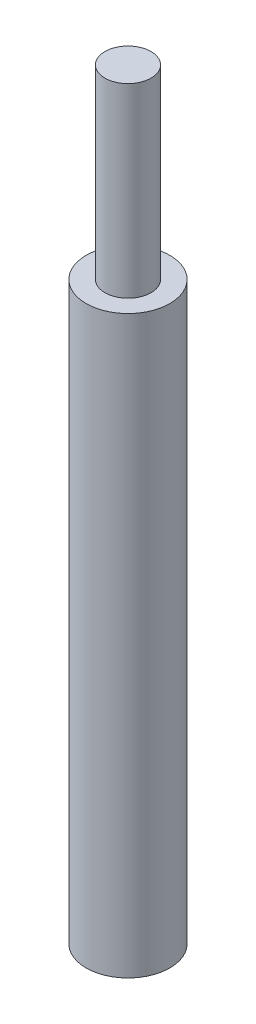
ISO-10303-21;
HEADER;
FILE_DESCRIPTION(('STEP AP214'),'2;1');
FILE_NAME('part.step','',(''),(''),'','','');
FILE_SCHEMA(('AUTOMOTIVE_DESIGN { 1 0 10303 214 1 1 1 1 }'));
ENDSEC;
DATA;
#1=APPLICATION_CONTEXT('core data for automotive mechanical design processes');
#2=APPLICATION_PROTOCOL_DEFINITION('international standard','automotive_design',2000,#1);
#3=PRODUCT_CONTEXT('',#1,'mechanical');
#4=PRODUCT('Part','Part','',(#3));
#5=PRODUCT_RELATED_PRODUCT_CATEGORY('part','',(#4));
#6=PRODUCT_DEFINITION_FORMATION('','',#4);
#7=PRODUCT_DEFINITION_CONTEXT('part definition',#1,'design');
#8=PRODUCT_DEFINITION('design','',#6,#7);
#9=PRODUCT_DEFINITION_SHAPE('','',#8);
#10=(LENGTH_UNIT() NAMED_UNIT(*) SI_UNIT(.MILLI.,.METRE.));
#11=(NAMED_UNIT(*) PLANE_ANGLE_UNIT() SI_UNIT($,.RADIAN.));
#12=(NAMED_UNIT(*) SI_UNIT($,.STERADIAN.) SOLID_ANGLE_UNIT());
#13=UNCERTAINTY_MEASURE_WITH_UNIT(LENGTH_MEASURE(1.E-05),#10,'distance_accuracy_value','');
#14=(GEOMETRIC_REPRESENTATION_CONTEXT(3) GLOBAL_UNCERTAINTY_ASSIGNED_CONTEXT((#13)) GLOBAL_UNIT_ASSIGNED_CONTEXT((#10,
#11,#12)) REPRESENTATION_CONTEXT('',''));
#15=CARTESIAN_POINT('',(0.,0.,0.));
#16=DIRECTION('',(0.,0.,1.));
#17=DIRECTION('',(1.,0.,0.));
#18=AXIS2_PLACEMENT_3D('',#15,#16,#17);
#19=CARTESIAN_POINT('',(0.,130.048,0.));
#20=DIRECTION('',(0.,-1.,0.));
#21=DIRECTION('',(0.,0.,-1.));
#22=AXIS2_PLACEMENT_3D('',#19,#20,#21);
#23=CYLINDRICAL_SURFACE('',#22,7.14375);
#24=CARTESIAN_POINT('',(0.,0.,0.));
#25=DIRECTION('',(0.,1.,0.));
#26=DIRECTION('',(0.,0.,1.));
#27=AXIS2_PLACEMENT_3D('',#24,#25,#26);
#28=CIRCLE('',#27,7.14375);
#29=CARTESIAN_POINT('',(0.,0.,7.14375));
#30=VERTEX_POINT('',#29);
#31=EDGE_CURVE('E11',#30,#30,#28,.T.);
#32=ORIENTED_EDGE('',*,*,#31,.T.);
#33=EDGE_LOOP('',(#32));
#34=FACE_BOUND('',#33,.T.);
#35=CARTESIAN_POINT('',(0.,98.298,0.));
#36=DIRECTION('',(0.,1.,0.));
#37=DIRECTION('',(0.,0.,1.));
#38=AXIS2_PLACEMENT_3D('',#35,#36,#37);
#39=CIRCLE('',#38,7.14375);
#40=CARTESIAN_POINT('',(0.,98.298,7.14375));
#41=VERTEX_POINT('',#40);
#42=EDGE_CURVE('E53',#41,#41,#39,.T.);
#43=ORIENTED_EDGE('',*,*,#42,.F.);
#44=EDGE_LOOP('',(#43));
#45=FACE_BOUND('',#44,.T.);
#46=ADVANCED_FACE('F33',(#34,#45),#23,.T.);
#47=CARTESIAN_POINT('',(0.,0.,0.));
#48=DIRECTION('',(0.,1.,0.));
#49=DIRECTION('',(0.,0.,1.));
#50=AXIS2_PLACEMENT_3D('',#47,#48,#49);
#51=PLANE('',#50);
#52=CARTESIAN_POINT('',(0.,0.,0.));
#53=DIRECTION('',(0.,-1.,0.));
#54=DIRECTION('',(0.,0.,-1.));
#55=AXIS2_PLACEMENT_3D('',#52,#53,#54);
#56=CIRCLE('',#55,4.5);
#57=CARTESIAN_POINT('',(0.,0.,-4.5));
#58=VERTEX_POINT('',#57);
#59=EDGE_CURVE('E51',#58,#58,#56,.T.);
#60=ORIENTED_EDGE('',*,*,#59,.F.);
#61=EDGE_LOOP('',(#60));
#62=FACE_BOUND('',#61,.T.);
#63=ORIENTED_EDGE('',*,*,#31,.F.);
#64=EDGE_LOOP('',(#63));
#65=FACE_BOUND('',#64,.T.);
#66=ADVANCED_FACE('F46',(#62,#65),#51,.F.);
#67=CARTESIAN_POINT('',(0.,15.,0.));
#68=DIRECTION('',(0.,-1.,0.));
#69=DIRECTION('',(0.,0.,-1.));
#70=AXIS2_PLACEMENT_3D('',#67,#68,#69);
#71=CONICAL_SURFACE('',#70,4.5,1.02974425867665);
#72=CARTESIAN_POINT('',(0.,17.703872785624,0.));
#73=VERTEX_POINT('',#72);
#74=VERTEX_LOOP('',#73);
#75=FACE_BOUND('',#74,.T.);
#76=CARTESIAN_POINT('',(0.,15.,0.));
#77=DIRECTION('',(0.,-1.,0.));
#78=DIRECTION('',(0.,0.,-1.));
#79=AXIS2_PLACEMENT_3D('',#76,#77,#78);
#80=CIRCLE('',#79,4.5);
#81=CARTESIAN_POINT('',(0.,15.,-4.5));
#82=VERTEX_POINT('',#81);
#83=EDGE_CURVE('E39',#82,#82,#80,.T.);
#84=ORIENTED_EDGE('',*,*,#83,.T.);
#85=EDGE_LOOP('',(#84));
#86=FACE_BOUND('',#85,.T.);
#87=ADVANCED_FACE('F42',(#75,#86),#71,.F.);
#88=CARTESIAN_POINT('',(0.,0.,0.));
#89=DIRECTION('',(0.,-1.,0.));
#90=DIRECTION('',(0.,0.,-1.));
#91=AXIS2_PLACEMENT_3D('',#88,#89,#90);
#92=CYLINDRICAL_SURFACE('',#91,4.5);
#93=ORIENTED_EDGE('',*,*,#83,.F.);
#94=EDGE_LOOP('',(#93));
#95=FACE_BOUND('',#94,.T.);
#96=ORIENTED_EDGE('',*,*,#59,.T.);
#97=EDGE_LOOP('',(#96));
#98=FACE_BOUND('',#97,.T.);
#99=ADVANCED_FACE('F45',(#95,#98),#92,.F.);
#100=CARTESIAN_POINT('',(0.,98.298,0.));
#101=DIRECTION('',(0.,1.,0.));
#102=DIRECTION('',(0.,0.,1.));
#103=AXIS2_PLACEMENT_3D('',#100,#101,#102);
#104=PLANE('',#103);
#105=CARTESIAN_POINT('',(0.,98.298,0.));
#106=DIRECTION('',(0.,1.,0.));
#107=DIRECTION('',(0.,0.,1.));
#108=AXIS2_PLACEMENT_3D('',#105,#106,#107);
#109=CIRCLE('',#108,3.937);
#110=CARTESIAN_POINT('',(0.,98.298,3.937));
#111=VERTEX_POINT('',#110);
#112=EDGE_CURVE('E58',#111,#111,#109,.T.);
#113=ORIENTED_EDGE('',*,*,#112,.F.);
#114=EDGE_LOOP('',(#113));
#115=FACE_BOUND('',#114,.T.);
#116=ORIENTED_EDGE('',*,*,#42,.T.);
#117=EDGE_LOOP('',(#116));
#118=FACE_BOUND('',#117,.T.);
#119=ADVANCED_FACE('F68',(#115,#118),#104,.T.);
#120=CARTESIAN_POINT('',(0.,98.298,0.));
#121=DIRECTION('',(0.,1.,0.));
#122=DIRECTION('',(0.,0.,1.));
#123=AXIS2_PLACEMENT_3D('',#120,#121,#122);
#124=CYLINDRICAL_SURFACE('',#123,3.937);
#125=ORIENTED_EDGE('',*,*,#112,.T.);
#126=EDGE_LOOP('',(#125));
#127=FACE_BOUND('',#126,.T.);
#128=CARTESIAN_POINT('',(0.,130.048,0.));
#129=DIRECTION('',(0.,1.,0.));
#130=DIRECTION('',(0.,0.,1.));
#131=AXIS2_PLACEMENT_3D('',#128,#129,#130);
#132=CIRCLE('',#131,3.937);
#133=CARTESIAN_POINT('',(0.,130.048,3.937));
#134=VERTEX_POINT('',#133);
#135=EDGE_CURVE('E59',#134,#134,#132,.T.);
#136=ORIENTED_EDGE('',*,*,#135,.F.);
#137=EDGE_LOOP('',(#136));
#138=FACE_BOUND('',#137,.T.);
#139=ADVANCED_FACE('F65',(#127,#138),#124,.T.);
#140=CARTESIAN_POINT('',(0.,130.048,0.));
#141=DIRECTION('',(0.,1.,0.));
#142=DIRECTION('',(0.,0.,1.));
#143=AXIS2_PLACEMENT_3D('',#140,#141,#142);
#144=PLANE('',#143);
#145=ORIENTED_EDGE('',*,*,#135,.T.);
#146=EDGE_LOOP('',(#145));
#147=FACE_BOUND('',#146,.T.);
#148=ADVANCED_FACE('F86',(#147),#144,.T.);
#149=CLOSED_SHELL('',(#46,#66,#87,#99,#119,#139,#148));
#150=MANIFOLD_SOLID_BREP('B2',#149);
#151=ADVANCED_BREP_SHAPE_REPRESENTATION('',(#18,#150),#14);
#152=SHAPE_DEFINITION_REPRESENTATION(#9,#151);
ENDSEC;
END-ISO-10303-21;
